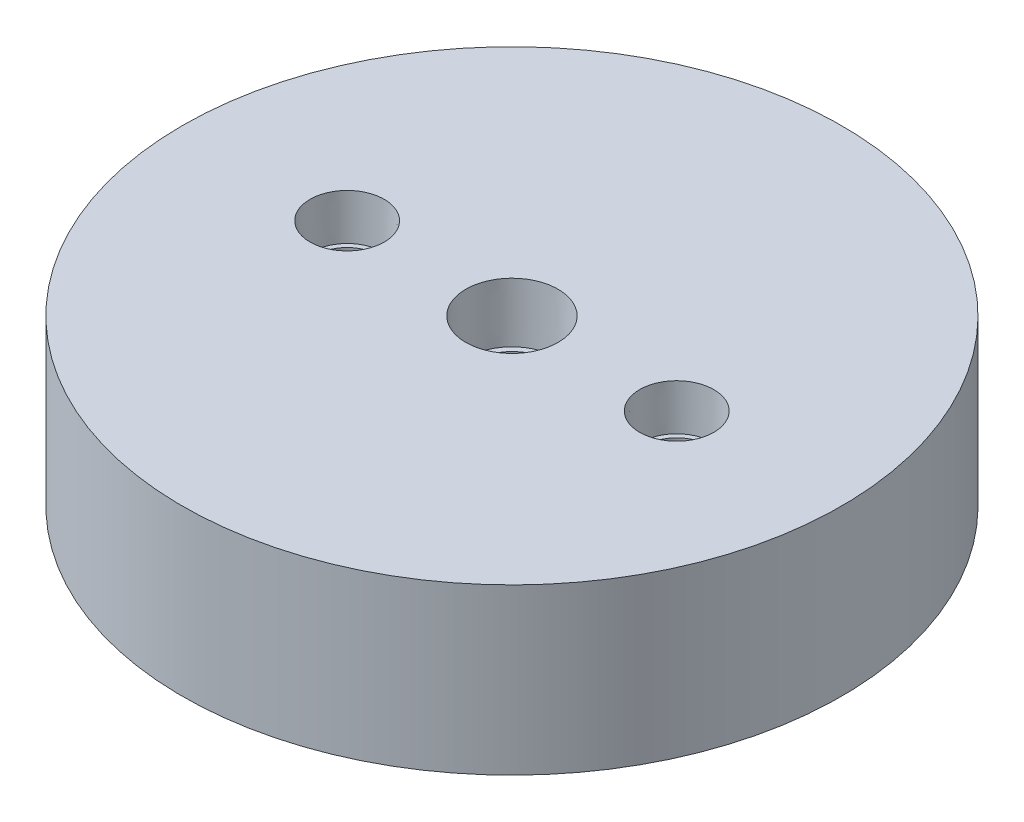
ISO-10303-21;
HEADER;
FILE_DESCRIPTION(('STEP AP214'),'2;1');
FILE_NAME('part.step','',(''),(''),'','','');
FILE_SCHEMA(('AUTOMOTIVE_DESIGN { 1 0 10303 214 1 1 1 1 }'));
ENDSEC;
DATA;
#1=APPLICATION_CONTEXT('core data for automotive mechanical design processes');
#2=APPLICATION_PROTOCOL_DEFINITION('international standard','automotive_design',2000,#1);
#3=PRODUCT_CONTEXT('',#1,'mechanical');
#4=PRODUCT('Part','Part','',(#3));
#5=PRODUCT_RELATED_PRODUCT_CATEGORY('part','',(#4));
#6=PRODUCT_DEFINITION_FORMATION('','',#4);
#7=PRODUCT_DEFINITION_CONTEXT('part definition',#1,'design');
#8=PRODUCT_DEFINITION('design','',#6,#7);
#9=PRODUCT_DEFINITION_SHAPE('','',#8);
#10=(LENGTH_UNIT() NAMED_UNIT(*) SI_UNIT(.MILLI.,.METRE.));
#11=(NAMED_UNIT(*) PLANE_ANGLE_UNIT() SI_UNIT($,.RADIAN.));
#12=(NAMED_UNIT(*) SI_UNIT($,.STERADIAN.) SOLID_ANGLE_UNIT());
#13=UNCERTAINTY_MEASURE_WITH_UNIT(LENGTH_MEASURE(1.E-05),#10,'distance_accuracy_value','');
#14=(GEOMETRIC_REPRESENTATION_CONTEXT(3) GLOBAL_UNCERTAINTY_ASSIGNED_CONTEXT((#13)) GLOBAL_UNIT_ASSIGNED_CONTEXT((#10,
#11,#12)) REPRESENTATION_CONTEXT('',''));
#15=CARTESIAN_POINT('',(0.,0.,0.));
#16=DIRECTION('',(0.,0.,1.));
#17=DIRECTION('',(1.,0.,0.));
#18=AXIS2_PLACEMENT_3D('',#15,#16,#17);
#19=CARTESIAN_POINT('',(0.,0.,0.));
#20=DIRECTION('',(0.,1.,0.));
#21=DIRECTION('',(-1.,0.,0.));
#22=AXIS2_PLACEMENT_3D('',#19,#20,#21);
#23=CYLINDRICAL_SURFACE('',#22,60.96);
#24=CARTESIAN_POINT('',(0.,-25.4,0.));
#25=DIRECTION('',(0.,1.,0.));
#26=DIRECTION('',(-1.,0.,0.));
#27=AXIS2_PLACEMENT_3D('',#24,#25,#26);
#28=CIRCLE('',#27,60.96);
#29=CARTESIAN_POINT('',(-60.96,-25.4,0.));
#30=VERTEX_POINT('',#29);
#31=EDGE_CURVE('E60',#30,#30,#28,.T.);
#32=ORIENTED_EDGE('',*,*,#31,.T.);
#33=EDGE_LOOP('',(#32));
#34=FACE_BOUND('',#33,.T.);
#35=CARTESIAN_POINT('',(0.,-38.1,0.));
#36=DIRECTION('',(0.,1.,0.));
#37=DIRECTION('',(-1.,0.,0.));
#38=AXIS2_PLACEMENT_3D('',#35,#36,#37);
#39=CIRCLE('',#38,60.96);
#40=CARTESIAN_POINT('',(-60.96,-38.1,0.));
#41=VERTEX_POINT('',#40);
#42=EDGE_CURVE('E10',#41,#41,#39,.T.);
#43=ORIENTED_EDGE('',*,*,#42,.F.);
#44=EDGE_LOOP('',(#43));
#45=FACE_BOUND('',#44,.T.);
#46=ADVANCED_FACE('F39',(#34,#45),#23,.F.);
#47=CARTESIAN_POINT('',(-76.2,-38.1,0.));
#48=DIRECTION('',(0.,-1.,0.));
#49=DIRECTION('',(1.,0.,0.));
#50=AXIS2_PLACEMENT_3D('',#47,#48,#49);
#51=PLANE('',#50);
#52=ORIENTED_EDGE('',*,*,#42,.T.);
#53=EDGE_LOOP('',(#52));
#54=FACE_BOUND('',#53,.T.);
#55=CARTESIAN_POINT('',(0.,-38.1,0.));
#56=DIRECTION('',(0.,1.,0.));
#57=DIRECTION('',(-1.,0.,0.));
#58=AXIS2_PLACEMENT_3D('',#55,#56,#57);
#59=CIRCLE('',#58,76.2);
#60=CARTESIAN_POINT('',(-76.2,-38.1,0.));
#61=VERTEX_POINT('',#60);
#62=EDGE_CURVE('E47',#61,#61,#59,.T.);
#63=ORIENTED_EDGE('',*,*,#62,.F.);
#64=EDGE_LOOP('',(#63));
#65=FACE_BOUND('',#64,.T.);
#66=ADVANCED_FACE('F113',(#54,#65),#51,.T.);
#67=CARTESIAN_POINT('',(0.,0.,0.));
#68=DIRECTION('',(0.,1.,0.));
#69=DIRECTION('',(-1.,0.,0.));
#70=AXIS2_PLACEMENT_3D('',#67,#68,#69);
#71=CYLINDRICAL_SURFACE('',#70,76.2);
#72=ORIENTED_EDGE('',*,*,#62,.T.);
#73=EDGE_LOOP('',(#72));
#74=FACE_BOUND('',#73,.T.);
#75=CARTESIAN_POINT('',(0.,0.,0.));
#76=DIRECTION('',(0.,1.,0.));
#77=DIRECTION('',(-1.,0.,0.));
#78=AXIS2_PLACEMENT_3D('',#75,#76,#77);
#79=CIRCLE('',#78,76.2);
#80=CARTESIAN_POINT('',(-76.2,0.,0.));
#81=VERTEX_POINT('',#80);
#82=EDGE_CURVE('E53',#81,#81,#79,.T.);
#83=ORIENTED_EDGE('',*,*,#82,.F.);
#84=EDGE_LOOP('',(#83));
#85=FACE_BOUND('',#84,.T.);
#86=ADVANCED_FACE('F111',(#74,#85),#71,.T.);
#87=CARTESIAN_POINT('',(0.,0.,0.));
#88=DIRECTION('',(0.,1.,0.));
#89=DIRECTION('',(-1.,0.,0.));
#90=AXIS2_PLACEMENT_3D('',#87,#88,#89);
#91=PLANE('',#90);
#92=CARTESIAN_POINT('',(-38.1,0.,0.));
#93=DIRECTION('',(0.,1.,0.));
#94=DIRECTION('',(0.,0.,1.));
#95=AXIS2_PLACEMENT_3D('',#92,#93,#94);
#96=CIRCLE('',#95,8.5750146);
#97=CARTESIAN_POINT('',(-38.1,0.,8.5750146));
#98=VERTEX_POINT('',#97);
#99=EDGE_CURVE('E211',#98,#98,#96,.T.);
#100=ORIENTED_EDGE('',*,*,#99,.F.);
#101=EDGE_LOOP('',(#100));
#102=FACE_BOUND('',#101,.T.);
#103=CARTESIAN_POINT('',(38.1,0.,0.));
#104=DIRECTION('',(0.,1.,0.));
#105=DIRECTION('',(0.,0.,1.));
#106=AXIS2_PLACEMENT_3D('',#103,#104,#105);
#107=CIRCLE('',#106,8.5750146);
#108=CARTESIAN_POINT('',(38.1,0.,8.5750146));
#109=VERTEX_POINT('',#108);
#110=EDGE_CURVE('E81',#109,#109,#107,.T.);
#111=ORIENTED_EDGE('',*,*,#110,.F.);
#112=EDGE_LOOP('',(#111));
#113=FACE_BOUND('',#112,.T.);
#114=CARTESIAN_POINT('',(0.,0.,0.));
#115=DIRECTION('',(0.,1.,0.));
#116=DIRECTION('',(0.,0.,1.));
#117=AXIS2_PLACEMENT_3D('',#114,#115,#116);
#118=CIRCLE('',#117,10.6647361);
#119=CARTESIAN_POINT('',(0.,0.,10.6647361));
#120=VERTEX_POINT('',#119);
#121=EDGE_CURVE('E65',#120,#120,#118,.T.);
#122=ORIENTED_EDGE('',*,*,#121,.F.);
#123=EDGE_LOOP('',(#122));
#124=FACE_BOUND('',#123,.T.);
#125=ORIENTED_EDGE('',*,*,#82,.T.);
#126=EDGE_LOOP('',(#125));
#127=FACE_BOUND('',#126,.T.);
#128=ADVANCED_FACE('F109',(#102,#113,#124,#127),#91,.T.);
#129=CARTESIAN_POINT('',(0.,-20.32,0.));
#130=DIRECTION('',(0.,-1.,0.));
#131=DIRECTION('',(1.,0.,0.));
#132=AXIS2_PLACEMENT_3D('',#129,#130,#131);
#133=CONICAL_SURFACE('',#132,22.225,1.37263165465243);
#134=CARTESIAN_POINT('',(0.,-17.64998248,0.));
#135=DIRECTION('',(0.,-1.,0.));
#136=DIRECTION('',(1.,0.,0.));
#137=AXIS2_PLACEMENT_3D('',#134,#135,#136);
#138=CIRCLE('',#137,8.9281);
#139=CARTESIAN_POINT('',(8.9281,-17.64998248,0.));
#140=VERTEX_POINT('',#139);
#141=EDGE_CURVE('E57',#140,#140,#138,.T.);
#142=ORIENTED_EDGE('',*,*,#141,.F.);
#143=EDGE_LOOP('',(#142));
#144=FACE_BOUND('',#143,.T.);
#145=CARTESIAN_POINT('',(0.,-20.32,0.));
#146=DIRECTION('',(0.,1.,0.));
#147=DIRECTION('',(-1.,0.,0.));
#148=AXIS2_PLACEMENT_3D('',#145,#146,#147);
#149=CIRCLE('',#148,22.225);
#150=CARTESIAN_POINT('',(-22.225,-20.32,0.));
#151=VERTEX_POINT('',#150);
#152=EDGE_CURVE('E102',#151,#151,#149,.T.);
#153=ORIENTED_EDGE('',*,*,#152,.F.);
#154=EDGE_LOOP('',(#153));
#155=FACE_BOUND('',#154,.T.);
#156=ADVANCED_FACE('F120',(#144,#155),#133,.F.);
#157=CARTESIAN_POINT('',(-28.575,-20.32,0.));
#158=DIRECTION('',(0.,-1.,0.));
#159=DIRECTION('',(1.,0.,0.));
#160=AXIS2_PLACEMENT_3D('',#157,#158,#159);
#161=PLANE('',#160);
#162=ORIENTED_EDGE('',*,*,#152,.T.);
#163=EDGE_LOOP('',(#162));
#164=FACE_BOUND('',#163,.T.);
#165=CARTESIAN_POINT('',(0.,-20.32,0.));
#166=DIRECTION('',(0.,1.,0.));
#167=DIRECTION('',(-1.,0.,0.));
#168=AXIS2_PLACEMENT_3D('',#165,#166,#167);
#169=CIRCLE('',#168,28.575);
#170=CARTESIAN_POINT('',(-28.575,-20.32,0.));
#171=VERTEX_POINT('',#170);
#172=EDGE_CURVE('E98',#171,#171,#169,.T.);
#173=ORIENTED_EDGE('',*,*,#172,.F.);
#174=EDGE_LOOP('',(#173));
#175=FACE_BOUND('',#174,.T.);
#176=ADVANCED_FACE('F143',(#164,#175),#161,.T.);
#177=CARTESIAN_POINT('',(0.,0.,0.));
#178=DIRECTION('',(0.,1.,0.));
#179=DIRECTION('',(-1.,0.,0.));
#180=AXIS2_PLACEMENT_3D('',#177,#178,#179);
#181=CYLINDRICAL_SURFACE('',#180,28.575);
#182=ORIENTED_EDGE('',*,*,#172,.T.);
#183=EDGE_LOOP('',(#182));
#184=FACE_BOUND('',#183,.T.);
#185=CARTESIAN_POINT('',(0.,-25.4,0.));
#186=DIRECTION('',(0.,1.,0.));
#187=DIRECTION('',(-1.,0.,0.));
#188=AXIS2_PLACEMENT_3D('',#185,#186,#187);
#189=CIRCLE('',#188,28.575);
#190=CARTESIAN_POINT('',(-28.575,-25.4,0.));
#191=VERTEX_POINT('',#190);
#192=EDGE_CURVE('E94',#191,#191,#189,.T.);
#193=ORIENTED_EDGE('',*,*,#192,.F.);
#194=EDGE_LOOP('',(#193));
#195=FACE_BOUND('',#194,.T.);
#196=ADVANCED_FACE('F133',(#184,#195),#181,.F.);
#197=CARTESIAN_POINT('',(-60.96,-25.4,0.));
#198=DIRECTION('',(0.,-1.,0.));
#199=DIRECTION('',(1.,0.,0.));
#200=AXIS2_PLACEMENT_3D('',#197,#198,#199);
#201=PLANE('',#200);
#202=CARTESIAN_POINT('',(-38.1,-25.4,0.));
#203=DIRECTION('',(0.,-1.,0.));
#204=DIRECTION('',(1.,0.,0.));
#205=AXIS2_PLACEMENT_3D('',#202,#203,#204);
#206=CIRCLE('',#205,7.1374);
#207=CARTESIAN_POINT('',(-30.9626,-25.4,0.));
#208=VERTEX_POINT('',#207);
#209=EDGE_CURVE('E42',#208,#208,#206,.T.);
#210=ORIENTED_EDGE('',*,*,#209,.F.);
#211=EDGE_LOOP('',(#210));
#212=FACE_BOUND('',#211,.T.);
#213=CARTESIAN_POINT('',(38.1,-25.4,0.));
#214=DIRECTION('',(0.,-1.,0.));
#215=DIRECTION('',(1.,0.,0.));
#216=AXIS2_PLACEMENT_3D('',#213,#214,#215);
#217=CIRCLE('',#216,7.13740000000001);
#218=CARTESIAN_POINT('',(45.2374,-25.4,0.));
#219=VERTEX_POINT('',#218);
#220=EDGE_CURVE('E62',#219,#219,#217,.T.);
#221=ORIENTED_EDGE('',*,*,#220,.F.);
#222=EDGE_LOOP('',(#221));
#223=FACE_BOUND('',#222,.T.);
#224=ORIENTED_EDGE('',*,*,#192,.T.);
#225=EDGE_LOOP('',(#224));
#226=FACE_BOUND('',#225,.T.);
#227=ORIENTED_EDGE('',*,*,#31,.F.);
#228=EDGE_LOOP('',(#227));
#229=FACE_BOUND('',#228,.T.);
#230=ADVANCED_FACE('F130',(#212,#223,#226,#229),#201,.T.);
#231=CARTESIAN_POINT('',(0.,0.,0.));
#232=DIRECTION('',(0.,1.,0.));
#233=DIRECTION('',(0.,0.,1.));
#234=AXIS2_PLACEMENT_3D('',#231,#232,#233);
#235=CYLINDRICAL_SURFACE('',#234,8.9281);
#236=ORIENTED_EDGE('',*,*,#141,.T.);
#237=EDGE_LOOP('',(#236));
#238=FACE_BOUND('',#237,.T.);
#239=CARTESIAN_POINT('',(0.,-13.462,0.));
#240=DIRECTION('',(0.,1.,0.));
#241=DIRECTION('',(0.,0.,1.));
#242=AXIS2_PLACEMENT_3D('',#239,#240,#241);
#243=CIRCLE('',#242,8.9281);
#244=CARTESIAN_POINT('',(0.,-13.462,8.9281));
#245=VERTEX_POINT('',#244);
#246=EDGE_CURVE('E61',#245,#245,#243,.T.);
#247=ORIENTED_EDGE('',*,*,#246,.T.);
#248=EDGE_LOOP('',(#247));
#249=FACE_BOUND('',#248,.T.);
#250=ADVANCED_FACE('F132',(#238,#249),#235,.F.);
#251=CARTESIAN_POINT('',(8.9281,-13.462,0.));
#252=DIRECTION('',(0.,-1.,0.));
#253=DIRECTION('',(0.,0.,-1.));
#254=AXIS2_PLACEMENT_3D('',#251,#252,#253);
#255=PLANE('',#254);
#256=ORIENTED_EDGE('',*,*,#246,.F.);
#257=EDGE_LOOP('',(#256));
#258=FACE_BOUND('',#257,.T.);
#259=CARTESIAN_POINT('',(0.,-13.462,0.));
#260=DIRECTION('',(0.,1.,0.));
#261=DIRECTION('',(0.,0.,1.));
#262=AXIS2_PLACEMENT_3D('',#259,#260,#261);
#263=CIRCLE('',#262,10.2616657920863);
#264=CARTESIAN_POINT('',(0.,-13.462,10.2616657920863));
#265=VERTEX_POINT('',#264);
#266=EDGE_CURVE('E72',#265,#265,#263,.T.);
#267=ORIENTED_EDGE('',*,*,#266,.T.);
#268=EDGE_LOOP('',(#267));
#269=FACE_BOUND('',#268,.T.);
#270=ADVANCED_FACE('F140',(#258,#269),#255,.F.);
#271=CARTESIAN_POINT('',(0.,0.,0.));
#272=DIRECTION('',(0.,1.,0.));
#273=DIRECTION('',(0.,0.,1.));
#274=AXIS2_PLACEMENT_3D('',#271,#272,#273);
#275=CONICAL_SURFACE('',#274,10.6647361,0.0299323966717028);
#276=ORIENTED_EDGE('',*,*,#266,.F.);
#277=EDGE_LOOP('',(#276));
#278=FACE_BOUND('',#277,.T.);
#279=ORIENTED_EDGE('',*,*,#121,.T.);
#280=EDGE_LOOP('',(#279));
#281=FACE_BOUND('',#280,.T.);
#282=ADVANCED_FACE('F170',(#278,#281),#275,.F.);
#283=CARTESIAN_POINT('',(38.1,0.,0.));
#284=DIRECTION('',(0.,1.,0.));
#285=DIRECTION('',(0.,0.,1.));
#286=AXIS2_PLACEMENT_3D('',#283,#284,#285);
#287=CYLINDRICAL_SURFACE('',#286,7.13740000000001);
#288=ORIENTED_EDGE('',*,*,#220,.T.);
#289=EDGE_LOOP('',(#288));
#290=FACE_BOUND('',#289,.T.);
#291=CARTESIAN_POINT('',(38.1,-10.414,0.));
#292=DIRECTION('',(0.,1.,0.));
#293=DIRECTION('',(0.,0.,1.));
#294=AXIS2_PLACEMENT_3D('',#291,#292,#293);
#295=CIRCLE('',#294,7.1374);
#296=CARTESIAN_POINT('',(38.1,-10.414,7.1374));
#297=VERTEX_POINT('',#296);
#298=EDGE_CURVE('E66',#297,#297,#295,.T.);
#299=ORIENTED_EDGE('',*,*,#298,.T.);
#300=EDGE_LOOP('',(#299));
#301=FACE_BOUND('',#300,.T.);
#302=ADVANCED_FACE('F175',(#290,#301),#287,.F.);
#303=CARTESIAN_POINT('',(45.2374,-10.414,0.));
#304=DIRECTION('',(0.,-1.,0.));
#305=DIRECTION('',(0.,0.,-1.));
#306=AXIS2_PLACEMENT_3D('',#303,#304,#305);
#307=PLANE('',#306);
#308=ORIENTED_EDGE('',*,*,#298,.F.);
#309=EDGE_LOOP('',(#308));
#310=FACE_BOUND('',#309,.T.);
#311=CARTESIAN_POINT('',(38.1,-10.414,0.));
#312=DIRECTION('',(0.,1.,0.));
#313=DIRECTION('',(0.,0.,1.));
#314=AXIS2_PLACEMENT_3D('',#311,#312,#313);
#315=CIRCLE('',#314,8.26320549387809);
#316=CARTESIAN_POINT('',(38.1,-10.414,8.26320549387809));
#317=VERTEX_POINT('',#316);
#318=EDGE_CURVE('E75',#317,#317,#315,.T.);
#319=ORIENTED_EDGE('',*,*,#318,.T.);
#320=EDGE_LOOP('',(#319));
#321=FACE_BOUND('',#320,.T.);
#322=ADVANCED_FACE('F182',(#310,#321),#307,.F.);
#323=CARTESIAN_POINT('',(38.1,0.,0.));
#324=DIRECTION('',(0.,1.,0.));
#325=DIRECTION('',(0.,0.,1.));
#326=AXIS2_PLACEMENT_3D('',#323,#324,#325);
#327=CONICAL_SURFACE('',#326,8.5750146,0.0299323966717029);
#328=ORIENTED_EDGE('',*,*,#318,.F.);
#329=EDGE_LOOP('',(#328));
#330=FACE_BOUND('',#329,.T.);
#331=ORIENTED_EDGE('',*,*,#110,.T.);
#332=EDGE_LOOP('',(#331));
#333=FACE_BOUND('',#332,.T.);
#334=ADVANCED_FACE('F187',(#330,#333),#327,.F.);
#335=CARTESIAN_POINT('',(-38.1,0.,0.));
#336=DIRECTION('',(0.,1.,0.));
#337=DIRECTION('',(0.,0.,1.));
#338=AXIS2_PLACEMENT_3D('',#335,#336,#337);
#339=CYLINDRICAL_SURFACE('',#338,7.1374);
#340=ORIENTED_EDGE('',*,*,#209,.T.);
#341=EDGE_LOOP('',(#340));
#342=FACE_BOUND('',#341,.T.);
#343=CARTESIAN_POINT('',(-38.1,-10.414,0.));
#344=DIRECTION('',(0.,1.,0.));
#345=DIRECTION('',(0.,0.,1.));
#346=AXIS2_PLACEMENT_3D('',#343,#344,#345);
#347=CIRCLE('',#346,7.1374);
#348=CARTESIAN_POINT('',(-38.1,-10.414,7.1374));
#349=VERTEX_POINT('',#348);
#350=EDGE_CURVE('E215',#349,#349,#347,.T.);
#351=ORIENTED_EDGE('',*,*,#350,.T.);
#352=EDGE_LOOP('',(#351));
#353=FACE_BOUND('',#352,.T.);
#354=ADVANCED_FACE('F191',(#342,#353),#339,.F.);
#355=CARTESIAN_POINT('',(-30.9626,-10.414,0.));
#356=DIRECTION('',(0.,-1.,0.));
#357=DIRECTION('',(0.,0.,-1.));
#358=AXIS2_PLACEMENT_3D('',#355,#356,#357);
#359=PLANE('',#358);
#360=ORIENTED_EDGE('',*,*,#350,.F.);
#361=EDGE_LOOP('',(#360));
#362=FACE_BOUND('',#361,.T.);
#363=CARTESIAN_POINT('',(-38.1,-10.414,0.));
#364=DIRECTION('',(0.,1.,0.));
#365=DIRECTION('',(0.,0.,1.));
#366=AXIS2_PLACEMENT_3D('',#363,#364,#365);
#367=CIRCLE('',#366,8.26320549387809);
#368=CARTESIAN_POINT('',(-38.1,-10.414,8.26320549387809));
#369=VERTEX_POINT('',#368);
#370=EDGE_CURVE('E208',#369,#369,#367,.T.);
#371=ORIENTED_EDGE('',*,*,#370,.T.);
#372=EDGE_LOOP('',(#371));
#373=FACE_BOUND('',#372,.T.);
#374=ADVANCED_FACE('F195',(#362,#373),#359,.F.);
#375=CARTESIAN_POINT('',(-38.1,0.,0.));
#376=DIRECTION('',(0.,1.,0.));
#377=DIRECTION('',(0.,0.,1.));
#378=AXIS2_PLACEMENT_3D('',#375,#376,#377);
#379=CONICAL_SURFACE('',#378,8.5750146,0.0299323966717029);
#380=ORIENTED_EDGE('',*,*,#370,.F.);
#381=EDGE_LOOP('',(#380));
#382=FACE_BOUND('',#381,.T.);
#383=ORIENTED_EDGE('',*,*,#99,.T.);
#384=EDGE_LOOP('',(#383));
#385=FACE_BOUND('',#384,.T.);
#386=ADVANCED_FACE('F199',(#382,#385),#379,.F.);
#387=CLOSED_SHELL('',(#46,#66,#86,#128,#156,#176,#196,#230,#250,#270,#282,#302,#322,#334,#354,
#374,#386));
#388=MANIFOLD_SOLID_BREP('B2',#387);
#389=ADVANCED_BREP_SHAPE_REPRESENTATION('',(#18,#388),#14);
#390=SHAPE_DEFINITION_REPRESENTATION(#9,#389);
ENDSEC;
END-ISO-10303-21;
